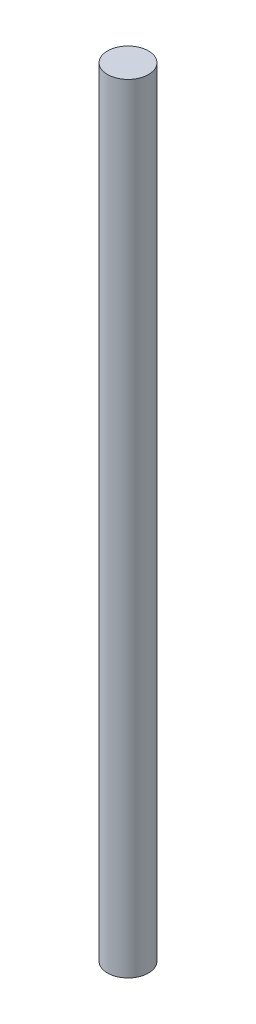
ISO-10303-21;
HEADER;
FILE_DESCRIPTION(('STEP AP214'),'2;1');
FILE_NAME('part.step','',(''),(''),'','','');
FILE_SCHEMA(('AUTOMOTIVE_DESIGN { 1 0 10303 214 1 1 1 1 }'));
ENDSEC;
DATA;
#1=APPLICATION_CONTEXT('core data for automotive mechanical design processes');
#2=APPLICATION_PROTOCOL_DEFINITION('international standard','automotive_design',2000,#1);
#3=PRODUCT_CONTEXT('',#1,'mechanical');
#4=PRODUCT('Part','Part','',(#3));
#5=PRODUCT_RELATED_PRODUCT_CATEGORY('part','',(#4));
#6=PRODUCT_DEFINITION_FORMATION('','',#4);
#7=PRODUCT_DEFINITION_CONTEXT('part definition',#1,'design');
#8=PRODUCT_DEFINITION('design','',#6,#7);
#9=PRODUCT_DEFINITION_SHAPE('','',#8);
#10=(LENGTH_UNIT() NAMED_UNIT(*) SI_UNIT(.MILLI.,.METRE.));
#11=(NAMED_UNIT(*) PLANE_ANGLE_UNIT() SI_UNIT($,.RADIAN.));
#12=(NAMED_UNIT(*) SI_UNIT($,.STERADIAN.) SOLID_ANGLE_UNIT());
#13=UNCERTAINTY_MEASURE_WITH_UNIT(LENGTH_MEASURE(1.E-05),#10,'distance_accuracy_value','');
#14=(GEOMETRIC_REPRESENTATION_CONTEXT(3) GLOBAL_UNCERTAINTY_ASSIGNED_CONTEXT((#13)) GLOBAL_UNIT_ASSIGNED_CONTEXT((#10,
#11,#12)) REPRESENTATION_CONTEXT('',''));
#15=CARTESIAN_POINT('',(0.,0.,0.));
#16=DIRECTION('',(0.,0.,1.));
#17=DIRECTION('',(1.,0.,0.));
#18=AXIS2_PLACEMENT_3D('',#15,#16,#17);
#19=CARTESIAN_POINT('',(-41.1647950147085,60.325,11.4406422822526));
#20=DIRECTION('',(0.,-1.,0.));
#21=DIRECTION('',(0.,0.,-1.));
#22=AXIS2_PLACEMENT_3D('',#19,#20,#21);
#23=CYLINDRICAL_SURFACE('',#22,1.5875);
#24=CARTESIAN_POINT('',(-41.1647950147085,60.325,11.4406422822526));
#25=DIRECTION('',(0.,1.,0.));
#26=DIRECTION('',(0.,0.,1.));
#27=AXIS2_PLACEMENT_3D('',#24,#25,#26);
#28=CIRCLE('',#27,1.5875);
#29=CARTESIAN_POINT('',(-41.1647950147085,60.325,9.85314228225261));
#30=VERTEX_POINT('',#29);
#31=EDGE_CURVE('E10',#30,#30,#28,.T.);
#32=CARTESIAN_POINT('',(-41.1647950147085,0.,11.4406422822526));
#33=DIRECTION('',(0.,1.,0.));
#34=DIRECTION('',(0.,0.,1.));
#35=AXIS2_PLACEMENT_3D('',#32,#33,#34);
#36=CIRCLE('',#35,1.5875);
#37=CARTESIAN_POINT('',(-41.1647950147085,0.,9.85314228225261));
#38=VERTEX_POINT('',#37);
#39=EDGE_CURVE('E34',#38,#38,#36,.T.);
#40=CARTESIAN_POINT('',(-41.1647950147085,60.325,9.85314228225261));
#41=CARTESIAN_POINT('',(-41.1647950147085,59.6966145833333,9.85314228225261));
#42=CARTESIAN_POINT('',(-41.1647950147085,59.0682291666667,9.85314228225261));
#43=CARTESIAN_POINT('',(-41.1647950147085,57.8114583333333,9.85314228225261));
#44=CARTESIAN_POINT('',(-41.1647950147085,57.1830729166667,9.85314228225261));
#45=CARTESIAN_POINT('',(-41.1647950147085,55.9263020833333,9.85314228225261));
#46=CARTESIAN_POINT('',(-41.1647950147085,55.2979166666667,9.85314228225261));
#47=CARTESIAN_POINT('',(-41.1647950147085,54.0411458333333,9.85314228225261));
#48=CARTESIAN_POINT('',(-41.1647950147085,53.4127604166667,9.85314228225261));
#49=CARTESIAN_POINT('',(-41.1647950147085,52.1559895833333,9.85314228225261));
#50=CARTESIAN_POINT('',(-41.1647950147085,51.5276041666667,9.85314228225261));
#51=CARTESIAN_POINT('',(-41.1647950147085,50.2708333333333,9.85314228225261));
#52=CARTESIAN_POINT('',(-41.1647950147085,49.6424479166667,9.85314228225261));
#53=CARTESIAN_POINT('',(-41.1647950147085,48.3856770833333,9.85314228225261));
#54=CARTESIAN_POINT('',(-41.1647950147085,47.7572916666667,9.85314228225261));
#55=CARTESIAN_POINT('',(-41.1647950147085,46.5005208333333,9.85314228225261));
#56=CARTESIAN_POINT('',(-41.1647950147085,45.8721354166667,9.85314228225261));
#57=CARTESIAN_POINT('',(-41.1647950147085,44.6153645833333,9.85314228225261));
#58=CARTESIAN_POINT('',(-41.1647950147085,43.9869791666667,9.85314228225261));
#59=CARTESIAN_POINT('',(-41.1647950147085,42.7302083333333,9.85314228225261));
#60=CARTESIAN_POINT('',(-41.1647950147085,42.1018229166667,9.85314228225261));
#61=CARTESIAN_POINT('',(-41.1647950147085,40.8450520833333,9.85314228225261));
#62=CARTESIAN_POINT('',(-41.1647950147085,40.2166666666667,9.85314228225261));
#63=CARTESIAN_POINT('',(-41.1647950147085,38.9598958333333,9.85314228225261));
#64=CARTESIAN_POINT('',(-41.1647950147085,38.3315104166667,9.85314228225261));
#65=CARTESIAN_POINT('',(-41.1647950147085,37.0747395833333,9.85314228225261));
#66=CARTESIAN_POINT('',(-41.1647950147085,36.4463541666667,9.85314228225261));
#67=CARTESIAN_POINT('',(-41.1647950147085,35.1895833333333,9.85314228225261));
#68=CARTESIAN_POINT('',(-41.1647950147085,34.5611979166667,9.85314228225261));
#69=CARTESIAN_POINT('',(-41.1647950147085,33.3044270833333,9.85314228225261));
#70=CARTESIAN_POINT('',(-41.1647950147085,32.6760416666667,9.85314228225261));
#71=CARTESIAN_POINT('',(-41.1647950147085,31.4192708333333,9.85314228225261));
#72=CARTESIAN_POINT('',(-41.1647950147085,30.7908854166667,9.85314228225261));
#73=CARTESIAN_POINT('',(-41.1647950147085,29.5341145833333,9.85314228225261));
#74=CARTESIAN_POINT('',(-41.1647950147085,28.9057291666667,9.85314228225261));
#75=CARTESIAN_POINT('',(-41.1647950147085,27.6489583333333,9.85314228225261));
#76=CARTESIAN_POINT('',(-41.1647950147085,27.0205729166667,9.85314228225261));
#77=CARTESIAN_POINT('',(-41.1647950147085,25.7638020833333,9.85314228225261));
#78=CARTESIAN_POINT('',(-41.1647950147085,25.1354166666667,9.85314228225261));
#79=CARTESIAN_POINT('',(-41.1647950147085,23.8786458333333,9.85314228225261));
#80=CARTESIAN_POINT('',(-41.1647950147085,23.2502604166667,9.85314228225261));
#81=CARTESIAN_POINT('',(-41.1647950147085,21.9934895833333,9.85314228225261));
#82=CARTESIAN_POINT('',(-41.1647950147085,21.3651041666667,9.85314228225261));
#83=CARTESIAN_POINT('',(-41.1647950147085,20.1083333333333,9.85314228225261));
#84=CARTESIAN_POINT('',(-41.1647950147085,19.4799479166667,9.85314228225261));
#85=CARTESIAN_POINT('',(-41.1647950147085,18.2231770833333,9.85314228225261));
#86=CARTESIAN_POINT('',(-41.1647950147085,17.5947916666667,9.85314228225261));
#87=CARTESIAN_POINT('',(-41.1647950147085,16.3380208333333,9.85314228225261));
#88=CARTESIAN_POINT('',(-41.1647950147085,15.7096354166667,9.85314228225261));
#89=CARTESIAN_POINT('',(-41.1647950147085,14.4528645833333,9.85314228225261));
#90=CARTESIAN_POINT('',(-41.1647950147085,13.8244791666667,9.85314228225261));
#91=CARTESIAN_POINT('',(-41.1647950147085,12.5677083333333,9.85314228225261));
#92=CARTESIAN_POINT('',(-41.1647950147085,11.9393229166667,9.85314228225261));
#93=CARTESIAN_POINT('',(-41.1647950147085,10.6825520833333,9.85314228225261));
#94=CARTESIAN_POINT('',(-41.1647950147085,10.0541666666667,9.85314228225261));
#95=CARTESIAN_POINT('',(-41.1647950147085,8.79739583333333,9.85314228225261));
#96=CARTESIAN_POINT('',(-41.1647950147085,8.16901041666667,9.85314228225261));
#97=CARTESIAN_POINT('',(-41.1647950147085,6.91223958333333,9.85314228225261));
#98=CARTESIAN_POINT('',(-41.1647950147085,6.28385416666667,9.85314228225261));
#99=CARTESIAN_POINT('',(-41.1647950147085,5.02708333333333,9.85314228225261));
#100=CARTESIAN_POINT('',(-41.1647950147085,4.39869791666666,9.85314228225261));
#101=CARTESIAN_POINT('',(-41.1647950147085,3.14192708333333,9.85314228225261));
#102=CARTESIAN_POINT('',(-41.1647950147085,2.51354166666667,9.85314228225261));
#103=CARTESIAN_POINT('',(-41.1647950147085,1.25677083333333,9.85314228225261));
#104=CARTESIAN_POINT('',(-41.1647950147085,0.628385416666666,9.85314228225261));
#105=CARTESIAN_POINT('',(-41.1647950147085,0.,9.85314228225261));
#106=B_SPLINE_CURVE_WITH_KNOTS('',3,(#40,#41,#42,#43,#44,#45,#46,#47,#48,#49,#50,#51,#52,#53,
#54,#55,#56,#57,#58,#59,#60,#61,#62,#63,#64,#65,#66,#67,#68,#69,#70,#71,#72,#73,#74,#75,#76,#77,
#78,#79,#80,#81,#82,#83,#84,#85,#86,#87,#88,#89,#90,#91,#92,#93,#94,#95,#96,#97,#98,#99,#100,
#101,#102,#103,#104,#105),.UNSPECIFIED.,.F.,.F.,(4,2,2,2,2,2,2,2,2,2,2,2,2,2,2,2,2,2,2,2,2,2,2,
2,2,2,2,2,2,2,2,2,4),(0.,1.88515625,3.7703125,5.65546875,7.540625,9.42578124999999,11.3109375,
13.19609375,15.08125,16.96640625,18.8515625,20.73671875,22.621875,24.50703125,26.3921875,
28.27734375,30.1625,32.04765625,33.9328125,35.81796875,37.703125,39.58828125,41.4734375,
43.35859375,45.24375,47.12890625,49.0140625,50.89921875,52.784375,54.66953125,56.5546875,
58.43984375,60.325),.UNSPECIFIED.);
#107=EDGE_CURVE('BSEAM31',#30,#38,#106,.T.);
#108=ORIENTED_EDGE('',*,*,#31,.F.);
#109=ORIENTED_EDGE('',*,*,#39,.T.);
#110=ORIENTED_EDGE('',*,*,#107,.T.);
#111=ORIENTED_EDGE('',*,*,#107,.F.);
#112=EDGE_LOOP('',(#108,#110,#109,#111));
#113=FACE_BOUND('',#112,.T.);
#114=ADVANCED_FACE('F31',(#113),#23,.T.);
#115=CARTESIAN_POINT('',(-41.1647950147085,60.325,11.4406422822526));
#116=DIRECTION('',(0.,1.,0.));
#117=DIRECTION('',(0.,0.,1.));
#118=AXIS2_PLACEMENT_3D('',#115,#116,#117);
#119=PLANE('',#118);
#120=ORIENTED_EDGE('',*,*,#31,.T.);
#121=EDGE_LOOP('',(#120));
#122=FACE_BOUND('',#121,.T.);
#123=ADVANCED_FACE('F46',(#122),#119,.T.);
#124=CARTESIAN_POINT('',(-41.1647950147085,0.,11.4406422822526));
#125=DIRECTION('',(0.,1.,0.));
#126=DIRECTION('',(0.,0.,1.));
#127=AXIS2_PLACEMENT_3D('',#124,#125,#126);
#128=PLANE('',#127);
#129=ORIENTED_EDGE('',*,*,#39,.F.);
#130=EDGE_LOOP('',(#129));
#131=FACE_BOUND('',#130,.T.);
#132=ADVANCED_FACE('F44',(#131),#128,.F.);
#133=CLOSED_SHELL('',(#114,#123,#132));
#134=MANIFOLD_SOLID_BREP('B2',#133);
#135=ADVANCED_BREP_SHAPE_REPRESENTATION('',(#18,#134),#14);
#136=SHAPE_DEFINITION_REPRESENTATION(#9,#135);
ENDSEC;
END-ISO-10303-21;
